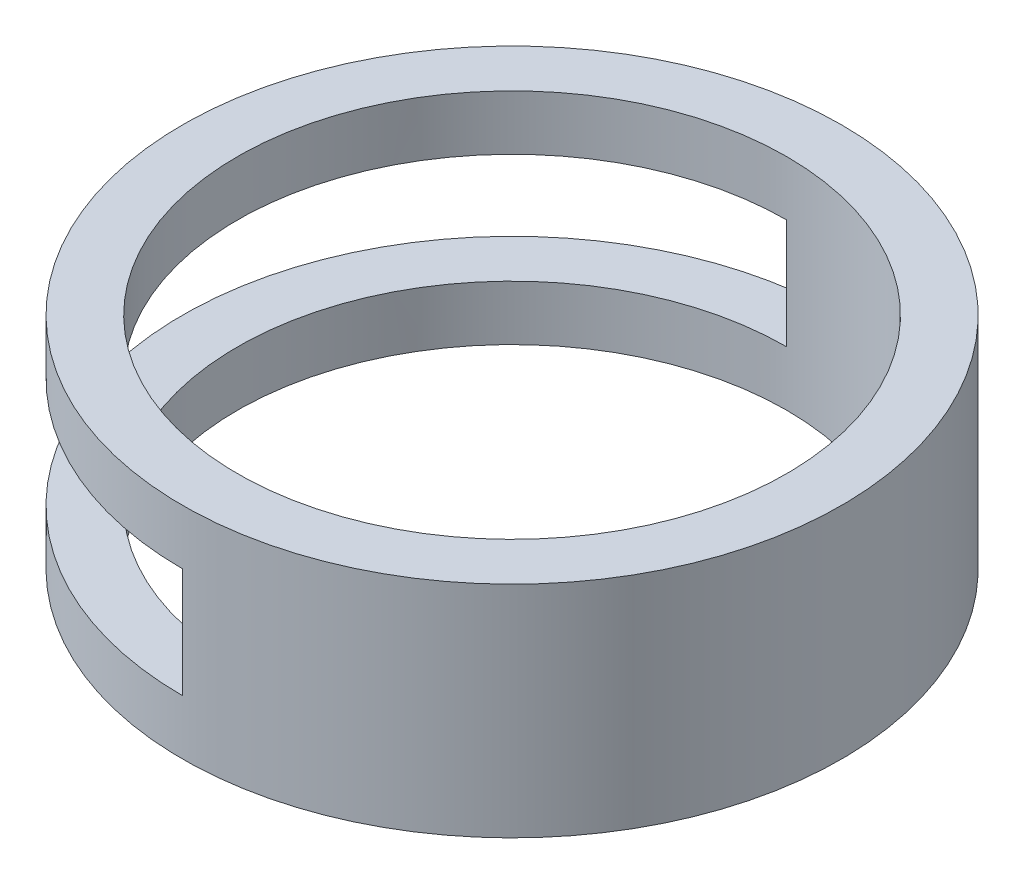
ISO-10303-21;
HEADER;
FILE_DESCRIPTION(('STEP AP214'),'2;1');
FILE_NAME('part.step','',(''),(''),'','','');
FILE_SCHEMA(('AUTOMOTIVE_DESIGN { 1 0 10303 214 1 1 1 1 }'));
ENDSEC;
DATA;
#1=APPLICATION_CONTEXT('core data for automotive mechanical design processes');
#2=APPLICATION_PROTOCOL_DEFINITION('international standard','automotive_design',2000,#1);
#3=PRODUCT_CONTEXT('',#1,'mechanical');
#4=PRODUCT('Part','Part','',(#3));
#5=PRODUCT_RELATED_PRODUCT_CATEGORY('part','',(#4));
#6=PRODUCT_DEFINITION_FORMATION('','',#4);
#7=PRODUCT_DEFINITION_CONTEXT('part definition',#1,'design');
#8=PRODUCT_DEFINITION('design','',#6,#7);
#9=PRODUCT_DEFINITION_SHAPE('','',#8);
#10=(LENGTH_UNIT() NAMED_UNIT(*) SI_UNIT(.MILLI.,.METRE.));
#11=(NAMED_UNIT(*) PLANE_ANGLE_UNIT() SI_UNIT($,.RADIAN.));
#12=(NAMED_UNIT(*) SI_UNIT($,.STERADIAN.) SOLID_ANGLE_UNIT());
#13=UNCERTAINTY_MEASURE_WITH_UNIT(LENGTH_MEASURE(1.E-05),#10,'distance_accuracy_value','');
#14=(GEOMETRIC_REPRESENTATION_CONTEXT(3) GLOBAL_UNCERTAINTY_ASSIGNED_CONTEXT((#13)) GLOBAL_UNIT_ASSIGNED_CONTEXT((#10,
#11,#12)) REPRESENTATION_CONTEXT('',''));
#15=CARTESIAN_POINT('',(0.,0.,0.));
#16=DIRECTION('',(0.,0.,1.));
#17=DIRECTION('',(1.,0.,0.));
#18=AXIS2_PLACEMENT_3D('',#15,#16,#17);
#19=CARTESIAN_POINT('',(25.0000000000034,-980.065573430904,0.));
#20=DIRECTION('',(0.,-1.,0.));
#21=DIRECTION('',(0.,0.,-1.));
#22=AXIS2_PLACEMENT_3D('',#19,#20,#21);
#23=CYLINDRICAL_SURFACE('',#22,25.0000000000034);
#24=CARTESIAN_POINT('',(25.0000000000034,-20.,0.));
#25=DIRECTION('',(0.,-1.,0.));
#26=DIRECTION('',(0.,0.,-1.));
#27=AXIS2_PLACEMENT_3D('',#24,#25,#26);
#28=CIRCLE('',#27,25.0000000000034);
#29=CARTESIAN_POINT('',(25.0000000000034,-20.,-25.0000000000034));
#30=VERTEX_POINT('',#29);
#31=EDGE_CURVE('E45',#30,#30,#28,.T.);
#32=ORIENTED_EDGE('',*,*,#31,.T.);
#33=EDGE_LOOP('',(#32));
#34=FACE_BOUND('',#33,.T.);
#35=CARTESIAN_POINT('',(25.0000000000034,0.,0.));
#36=DIRECTION('',(0.,-1.,0.));
#37=DIRECTION('',(0.,0.,-1.));
#38=AXIS2_PLACEMENT_3D('',#35,#36,#37);
#39=CIRCLE('',#38,25.0000000000034);
#40=CARTESIAN_POINT('',(25.0000000000034,0.,-25.0000000000034));
#41=VERTEX_POINT('',#40);
#42=EDGE_CURVE('E11',#41,#41,#39,.T.);
#43=ORIENTED_EDGE('',*,*,#42,.F.);
#44=EDGE_LOOP('',(#43));
#45=FACE_BOUND('',#44,.T.);
#46=CARTESIAN_POINT('',(25.0000000000034,-15.,0.));
#47=DIRECTION('',(0.,-1.,0.));
#48=DIRECTION('',(0.,0.,-1.));
#49=AXIS2_PLACEMENT_3D('',#46,#47,#48);
#50=CIRCLE('',#49,25.0000000000034);
#51=CARTESIAN_POINT('',(25.0000000000035,-15.,25.0000000000034));
#52=VERTEX_POINT('',#51);
#53=CARTESIAN_POINT('',(25.0000000000035,-15.,-25.0000000000034));
#54=VERTEX_POINT('',#53);
#55=EDGE_CURVE('E93',#52,#54,#50,.T.);
#56=ORIENTED_EDGE('',*,*,#55,.F.);
#57=DIRECTION('',(0.,-1.,0.));
#58=VECTOR('',#57,1.);
#59=CARTESIAN_POINT('',(25.0000000000035,-5.,25.0000000000034));
#60=LINE('',#59,#58);
#61=CARTESIAN_POINT('',(25.0000000000035,-5.,25.0000000000034));
#62=VERTEX_POINT('',#61);
#63=EDGE_CURVE('E92',#62,#52,#60,.T.);
#64=ORIENTED_EDGE('',*,*,#63,.F.);
#65=CARTESIAN_POINT('',(25.0000000000034,-5.,0.));
#66=DIRECTION('',(0.,-1.,0.));
#67=DIRECTION('',(0.,0.,-1.));
#68=AXIS2_PLACEMENT_3D('',#65,#66,#67);
#69=CIRCLE('',#68,25.0000000000034);
#70=CARTESIAN_POINT('',(25.0000000000035,-5.,-25.0000000000034));
#71=VERTEX_POINT('',#70);
#72=EDGE_CURVE('E78',#62,#71,#69,.T.);
#73=ORIENTED_EDGE('',*,*,#72,.T.);
#74=DIRECTION('',(0.,-1.,0.));
#75=VECTOR('',#74,1.);
#76=CARTESIAN_POINT('',(25.0000000000035,-5.,-25.0000000000034));
#77=LINE('',#76,#75);
#78=EDGE_CURVE('E83',#71,#54,#77,.T.);
#79=ORIENTED_EDGE('',*,*,#78,.T.);
#80=EDGE_LOOP('',(#56,#64,#73,#79));
#81=FACE_BOUND('',#80,.T.);
#82=ADVANCED_FACE('F37',(#34,#45,#81),#23,.F.);
#83=CARTESIAN_POINT('',(25.0000000000034,-980.065573430904,0.));
#84=DIRECTION('',(0.,-1.,0.));
#85=DIRECTION('',(0.,0.,-1.));
#86=AXIS2_PLACEMENT_3D('',#83,#84,#85);
#87=CYLINDRICAL_SURFACE('',#86,30.0000000000034);
#88=CARTESIAN_POINT('',(25.0000000000034,0.,0.));
#89=DIRECTION('',(0.,-1.,0.));
#90=DIRECTION('',(0.,0.,-1.));
#91=AXIS2_PLACEMENT_3D('',#88,#89,#90);
#92=CIRCLE('',#91,30.0000000000034);
#93=CARTESIAN_POINT('',(25.0000000000034,0.,-30.0000000000034));
#94=VERTEX_POINT('',#93);
#95=EDGE_CURVE('E95',#94,#94,#92,.T.);
#96=ORIENTED_EDGE('',*,*,#95,.T.);
#97=EDGE_LOOP('',(#96));
#98=FACE_BOUND('',#97,.T.);
#99=CARTESIAN_POINT('',(25.0000000000034,-20.,0.));
#100=DIRECTION('',(0.,-1.,0.));
#101=DIRECTION('',(0.,0.,-1.));
#102=AXIS2_PLACEMENT_3D('',#99,#100,#101);
#103=CIRCLE('',#102,30.0000000000034);
#104=CARTESIAN_POINT('',(25.0000000000034,-20.,-30.0000000000034));
#105=VERTEX_POINT('',#104);
#106=EDGE_CURVE('E103',#105,#105,#103,.T.);
#107=ORIENTED_EDGE('',*,*,#106,.F.);
#108=EDGE_LOOP('',(#107));
#109=FACE_BOUND('',#108,.T.);
#110=DIRECTION('',(0.,1.,0.));
#111=VECTOR('',#110,1.);
#112=CARTESIAN_POINT('',(25.0000000000035,-15.,30.0000000000034));
#113=LINE('',#112,#111);
#114=CARTESIAN_POINT('',(25.0000000000035,-15.,30.0000000000034));
#115=VERTEX_POINT('',#114);
#116=CARTESIAN_POINT('',(25.0000000000035,-5.,30.0000000000034));
#117=VERTEX_POINT('',#116);
#118=EDGE_CURVE('E123',#115,#117,#113,.T.);
#119=ORIENTED_EDGE('',*,*,#118,.F.);
#120=CARTESIAN_POINT('',(25.0000000000034,-15.,0.));
#121=DIRECTION('',(0.,-1.,0.));
#122=DIRECTION('',(0.,0.,-1.));
#123=AXIS2_PLACEMENT_3D('',#120,#121,#122);
#124=CIRCLE('',#123,30.0000000000034);
#125=CARTESIAN_POINT('',(25.0000000000035,-15.,-30.0000000000034));
#126=VERTEX_POINT('',#125);
#127=EDGE_CURVE('E97',#115,#126,#124,.T.);
#128=ORIENTED_EDGE('',*,*,#127,.T.);
#129=DIRECTION('',(0.,1.,0.));
#130=VECTOR('',#129,1.);
#131=CARTESIAN_POINT('',(25.0000000000035,-15.,-30.0000000000034));
#132=LINE('',#131,#130);
#133=CARTESIAN_POINT('',(25.0000000000035,-5.,-30.0000000000034));
#134=VERTEX_POINT('',#133);
#135=EDGE_CURVE('E84',#126,#134,#132,.T.);
#136=ORIENTED_EDGE('',*,*,#135,.T.);
#137=CARTESIAN_POINT('',(25.0000000000034,-5.,0.));
#138=DIRECTION('',(0.,-1.,0.));
#139=DIRECTION('',(0.,0.,-1.));
#140=AXIS2_PLACEMENT_3D('',#137,#138,#139);
#141=CIRCLE('',#140,30.0000000000034);
#142=EDGE_CURVE('E81',#117,#134,#141,.T.);
#143=ORIENTED_EDGE('',*,*,#142,.F.);
#144=EDGE_LOOP('',(#119,#128,#136,#143));
#145=FACE_BOUND('',#144,.T.);
#146=ADVANCED_FACE('F116',(#98,#109,#145),#87,.T.);
#147=CARTESIAN_POINT('',(-5.,0.,0.));
#148=DIRECTION('',(0.,1.,0.));
#149=DIRECTION('',(0.,0.,1.));
#150=AXIS2_PLACEMENT_3D('',#147,#148,#149);
#151=PLANE('',#150);
#152=ORIENTED_EDGE('',*,*,#42,.T.);
#153=EDGE_LOOP('',(#152));
#154=FACE_BOUND('',#153,.T.);
#155=ORIENTED_EDGE('',*,*,#95,.F.);
#156=EDGE_LOOP('',(#155));
#157=FACE_BOUND('',#156,.T.);
#158=ADVANCED_FACE('F39',(#154,#157),#151,.T.);
#159=CARTESIAN_POINT('',(-5.,-20.,0.));
#160=DIRECTION('',(0.,1.,0.));
#161=DIRECTION('',(0.,0.,1.));
#162=AXIS2_PLACEMENT_3D('',#159,#160,#161);
#163=PLANE('',#162);
#164=ORIENTED_EDGE('',*,*,#31,.F.);
#165=EDGE_LOOP('',(#164));
#166=FACE_BOUND('',#165,.T.);
#167=ORIENTED_EDGE('',*,*,#106,.T.);
#168=EDGE_LOOP('',(#167));
#169=FACE_BOUND('',#168,.T.);
#170=ADVANCED_FACE('F110',(#166,#169),#163,.F.);
#171=CARTESIAN_POINT('',(25.0000000000035,-5.,30.0000000000034));
#172=DIRECTION('',(0.,1.,0.));
#173=DIRECTION('',(0.,0.,1.));
#174=AXIS2_PLACEMENT_3D('',#171,#172,#173);
#175=PLANE('',#174);
#176=ORIENTED_EDGE('',*,*,#72,.F.);
#177=DIRECTION('',(0.,0.,-1.));
#178=VECTOR('',#177,1.);
#179=CARTESIAN_POINT('',(25.0000000000035,-5.,30.0000000000034));
#180=LINE('',#179,#178);
#181=EDGE_CURVE('E126',#117,#62,#180,.T.);
#182=ORIENTED_EDGE('',*,*,#181,.F.);
#183=ORIENTED_EDGE('',*,*,#142,.T.);
#184=DIRECTION('',(0.,0.,1.));
#185=VECTOR('',#184,1.);
#186=CARTESIAN_POINT('',(25.0000000000035,-5.,-30.0000000000034));
#187=LINE('',#186,#185);
#188=EDGE_CURVE('E57',#134,#71,#187,.T.);
#189=ORIENTED_EDGE('',*,*,#188,.T.);
#190=EDGE_LOOP('',(#176,#182,#183,#189));
#191=FACE_BOUND('',#190,.T.);
#192=ADVANCED_FACE('F75',(#191),#175,.F.);
#193=CARTESIAN_POINT('',(25.0000000000035,-15.,25.0000000000034));
#194=DIRECTION('',(0.,-1.,0.));
#195=DIRECTION('',(0.,0.,-1.));
#196=AXIS2_PLACEMENT_3D('',#193,#194,#195);
#197=PLANE('',#196);
#198=DIRECTION('',(0.,0.,1.));
#199=VECTOR('',#198,1.);
#200=CARTESIAN_POINT('',(25.0000000000035,-15.,25.0000000000034));
#201=LINE('',#200,#199);
#202=EDGE_CURVE('E132',#52,#115,#201,.T.);
#203=ORIENTED_EDGE('',*,*,#202,.F.);
#204=ORIENTED_EDGE('',*,*,#55,.T.);
#205=DIRECTION('',(0.,0.,-1.));
#206=VECTOR('',#205,1.);
#207=CARTESIAN_POINT('',(25.0000000000035,-15.,-25.0000000000034));
#208=LINE('',#207,#206);
#209=EDGE_CURVE('E52',#54,#126,#208,.T.);
#210=ORIENTED_EDGE('',*,*,#209,.T.);
#211=ORIENTED_EDGE('',*,*,#127,.F.);
#212=EDGE_LOOP('',(#203,#204,#210,#211));
#213=FACE_BOUND('',#212,.T.);
#214=ADVANCED_FACE('F136',(#213),#197,.F.);
#215=CARTESIAN_POINT('',(25.0000000000035,0.,25.0000000000034));
#216=DIRECTION('',(-1.,0.,0.));
#217=DIRECTION('',(0.,0.,1.));
#218=AXIS2_PLACEMENT_3D('',#215,#216,#217);
#219=PLANE('',#218);
#220=ORIENTED_EDGE('',*,*,#118,.T.);
#221=ORIENTED_EDGE('',*,*,#181,.T.);
#222=ORIENTED_EDGE('',*,*,#63,.T.);
#223=ORIENTED_EDGE('',*,*,#202,.T.);
#224=EDGE_LOOP('',(#220,#221,#222,#223));
#225=FACE_BOUND('',#224,.T.);
#226=ADVANCED_FACE('F134',(#225),#219,.T.);
#227=CARTESIAN_POINT('',(25.0000000000035,0.,-25.0000000000034));
#228=DIRECTION('',(1.,0.,0.));
#229=DIRECTION('',(0.,0.,-1.));
#230=AXIS2_PLACEMENT_3D('',#227,#228,#229);
#231=PLANE('',#230);
#232=ORIENTED_EDGE('',*,*,#135,.F.);
#233=ORIENTED_EDGE('',*,*,#209,.F.);
#234=ORIENTED_EDGE('',*,*,#78,.F.);
#235=ORIENTED_EDGE('',*,*,#188,.F.);
#236=EDGE_LOOP('',(#232,#233,#234,#235));
#237=FACE_BOUND('',#236,.T.);
#238=ADVANCED_FACE('F87',(#237),#231,.F.);
#239=CLOSED_SHELL('',(#82,#146,#158,#170,#192,#214,#226,#238));
#240=MANIFOLD_SOLID_BREP('B2',#239);
#241=ADVANCED_BREP_SHAPE_REPRESENTATION('',(#18,#240),#14);
#242=SHAPE_DEFINITION_REPRESENTATION(#9,#241);
ENDSEC;
END-ISO-10303-21;
